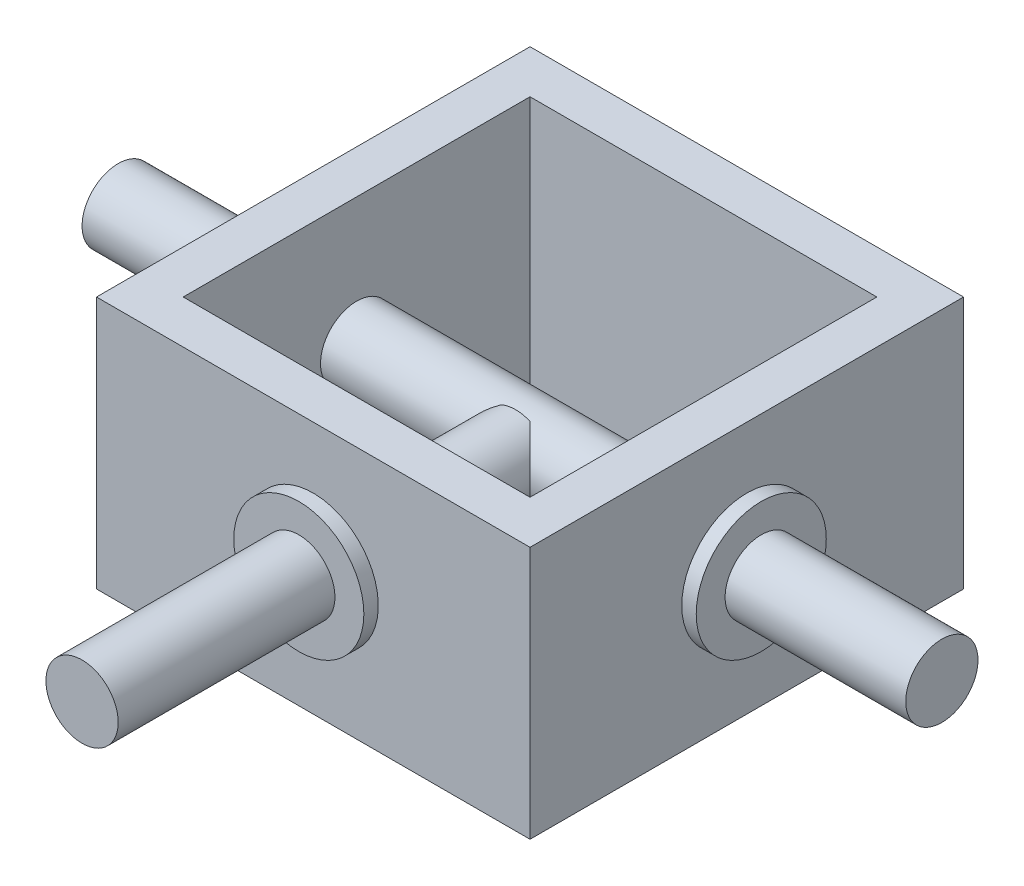
ISO-10303-21;
HEADER;
FILE_DESCRIPTION(('STEP AP214'),'2;1');
FILE_NAME('part.step','',(''),(''),'','','');
FILE_SCHEMA(('AUTOMOTIVE_DESIGN { 1 0 10303 214 1 1 1 1 }'));
ENDSEC;
DATA;
#1=APPLICATION_CONTEXT('core data for automotive mechanical design processes');
#2=APPLICATION_PROTOCOL_DEFINITION('international standard','automotive_design',2000,#1);
#3=PRODUCT_CONTEXT('',#1,'mechanical');
#4=PRODUCT('Part','Part','',(#3));
#5=PRODUCT_RELATED_PRODUCT_CATEGORY('part','',(#4));
#6=PRODUCT_DEFINITION_FORMATION('','',#4);
#7=PRODUCT_DEFINITION_CONTEXT('part definition',#1,'design');
#8=PRODUCT_DEFINITION('design','',#6,#7);
#9=PRODUCT_DEFINITION_SHAPE('','',#8);
#10=(LENGTH_UNIT() NAMED_UNIT(*) SI_UNIT(.MILLI.,.METRE.));
#11=(NAMED_UNIT(*) PLANE_ANGLE_UNIT() SI_UNIT($,.RADIAN.));
#12=(NAMED_UNIT(*) SI_UNIT($,.STERADIAN.) SOLID_ANGLE_UNIT());
#13=UNCERTAINTY_MEASURE_WITH_UNIT(LENGTH_MEASURE(1.E-05),#10,'distance_accuracy_value','');
#14=(GEOMETRIC_REPRESENTATION_CONTEXT(3) GLOBAL_UNCERTAINTY_ASSIGNED_CONTEXT((#13)) GLOBAL_UNIT_ASSIGNED_CONTEXT((#10,
#11,#12)) REPRESENTATION_CONTEXT('',''));
#15=CARTESIAN_POINT('',(0.,0.,0.));
#16=DIRECTION('',(0.,0.,1.));
#17=DIRECTION('',(1.,0.,0.));
#18=AXIS2_PLACEMENT_3D('',#15,#16,#17);
#19=CARTESIAN_POINT('',(-57.,17.5,0.));
#20=DIRECTION('',(1.,0.,0.));
#21=DIRECTION('',(0.,0.,-1.));
#22=AXIS2_PLACEMENT_3D('',#19,#20,#21);
#23=CYLINDRICAL_SURFACE('',#22,5.);
#24=CARTESIAN_POINT('',(24.,17.5,0.));
#25=DIRECTION('',(-1.,0.,0.));
#26=DIRECTION('',(0.,0.,1.));
#27=AXIS2_PLACEMENT_3D('',#24,#25,#26);
#28=CIRCLE('',#27,5.);
#29=CARTESIAN_POINT('',(24.,17.5,5.));
#30=VERTEX_POINT('',#29);
#31=EDGE_CURVE('E154',#30,#30,#28,.T.);
#32=ORIENTED_EDGE('',*,*,#31,.T.);
#33=EDGE_LOOP('',(#32));
#34=FACE_BOUND('',#33,.T.);
#35=CARTESIAN_POINT('',(-24.,17.5,0.));
#36=DIRECTION('',(1.,0.,0.));
#37=DIRECTION('',(0.,0.,-1.));
#38=AXIS2_PLACEMENT_3D('',#35,#36,#37);
#39=CIRCLE('',#38,5.);
#40=CARTESIAN_POINT('',(-24.,17.5,-5.));
#41=VERTEX_POINT('',#40);
#42=EDGE_CURVE('E150',#41,#41,#39,.T.);
#43=ORIENTED_EDGE('',*,*,#42,.T.);
#44=EDGE_LOOP('',(#43));
#45=FACE_BOUND('',#44,.T.);
#46=CARTESIAN_POINT('',(0.,17.5,0.));
#47=DIRECTION('',(0.707106781186547,0.,-0.707106781186548));
#48=DIRECTION('',(0.707106781186547,0.,0.707106781186548));
#49=AXIS2_PLACEMENT_3D('',#46,#47,#48);
#50=ELLIPSE('',#49,7.07106781186548,5.);
#51=CARTESIAN_POINT('',(2.00000000000001,12.9174243050442,2.));
#52=VERTEX_POINT('',#51);
#53=CARTESIAN_POINT('',(2.00000000000001,22.0825756949558,2.));
#54=VERTEX_POINT('',#53);
#55=EDGE_CURVE('E127',#52,#54,#50,.F.);
#56=ORIENTED_EDGE('',*,*,#55,.F.);
#57=DIRECTION('',(1.,0.,0.));
#58=VECTOR('',#57,1.);
#59=CARTESIAN_POINT('',(-57.,12.9174243050442,2.));
#60=LINE('',#59,#58);
#61=CARTESIAN_POINT('',(-2.00000000000001,12.9174243050442,2.));
#62=VERTEX_POINT('',#61);
#63=EDGE_CURVE('E11',#52,#62,#60,.F.);
#64=ORIENTED_EDGE('',*,*,#63,.T.);
#65=CARTESIAN_POINT('',(0.,17.5,0.));
#66=DIRECTION('',(0.707106781186547,0.,0.707106781186548));
#67=DIRECTION('',(0.707106781186547,0.,-0.707106781186548));
#68=AXIS2_PLACEMENT_3D('',#65,#66,#67);
#69=ELLIPSE('',#68,7.07106781186548,5.);
#70=CARTESIAN_POINT('',(-2.00000000000001,22.0825756949558,2.));
#71=VERTEX_POINT('',#70);
#72=EDGE_CURVE('E54',#71,#62,#69,.T.);
#73=ORIENTED_EDGE('',*,*,#72,.F.);
#74=DIRECTION('',(1.,0.,0.));
#75=VECTOR('',#74,1.);
#76=CARTESIAN_POINT('',(-57.,22.0825756949558,2.));
#77=LINE('',#76,#75);
#78=EDGE_CURVE('E121',#71,#54,#77,.T.);
#79=ORIENTED_EDGE('',*,*,#78,.T.);
#80=EDGE_LOOP('',(#56,#64,#73,#79));
#81=FACE_BOUND('',#80,.T.);
#82=ADVANCED_FACE('F45',(#34,#45,#81),#23,.T.);
#83=CARTESIAN_POINT('',(30.,35.,30.));
#84=DIRECTION('',(-1.,0.,0.));
#85=DIRECTION('',(0.,0.,1.));
#86=AXIS2_PLACEMENT_3D('',#83,#84,#85);
#87=PLANE('',#86);
#88=DIRECTION('',(0.,0.,-1.));
#89=VECTOR('',#88,1.);
#90=CARTESIAN_POINT('',(30.,0.,30.));
#91=LINE('',#90,#89);
#92=CARTESIAN_POINT('',(30.,0.,30.));
#93=VERTEX_POINT('',#92);
#94=CARTESIAN_POINT('',(30.,0.,-30.));
#95=VERTEX_POINT('',#94);
#96=EDGE_CURVE('E182',#93,#95,#91,.T.);
#97=ORIENTED_EDGE('',*,*,#96,.T.);
#98=DIRECTION('',(0.,-1.,0.));
#99=VECTOR('',#98,1.);
#100=CARTESIAN_POINT('',(30.,35.,-30.));
#101=LINE('',#100,#99);
#102=CARTESIAN_POINT('',(30.,35.,-30.));
#103=VERTEX_POINT('',#102);
#104=EDGE_CURVE('E149',#103,#95,#101,.T.);
#105=ORIENTED_EDGE('',*,*,#104,.F.);
#106=DIRECTION('',(0.,0.,-1.));
#107=VECTOR('',#106,1.);
#108=CARTESIAN_POINT('',(30.,35.,30.));
#109=LINE('',#108,#107);
#110=CARTESIAN_POINT('',(30.,35.,30.));
#111=VERTEX_POINT('',#110);
#112=EDGE_CURVE('E175',#111,#103,#109,.T.);
#113=ORIENTED_EDGE('',*,*,#112,.F.);
#114=DIRECTION('',(0.,-1.,0.));
#115=VECTOR('',#114,1.);
#116=CARTESIAN_POINT('',(30.,35.,30.));
#117=LINE('',#116,#115);
#118=EDGE_CURVE('E167',#111,#93,#117,.T.);
#119=ORIENTED_EDGE('',*,*,#118,.T.);
#120=EDGE_LOOP('',(#97,#105,#113,#119));
#121=FACE_BOUND('',#120,.T.);
#122=CARTESIAN_POINT('',(30.,17.5,0.));
#123=DIRECTION('',(-1.,0.,0.));
#124=DIRECTION('',(0.,0.,1.));
#125=AXIS2_PLACEMENT_3D('',#122,#123,#124);
#126=CIRCLE('',#125,9.);
#127=CARTESIAN_POINT('',(30.,17.5,9.));
#128=VERTEX_POINT('',#127);
#129=EDGE_CURVE('E128',#128,#128,#126,.F.);
#130=ORIENTED_EDGE('',*,*,#129,.F.);
#131=EDGE_LOOP('',(#130));
#132=FACE_BOUND('',#131,.T.);
#133=ADVANCED_FACE('F47',(#121,#132),#87,.F.);
#134=CARTESIAN_POINT('',(-30.,35.,30.));
#135=DIRECTION('',(0.,0.,-1.));
#136=DIRECTION('',(-1.,0.,0.));
#137=AXIS2_PLACEMENT_3D('',#134,#135,#136);
#138=PLANE('',#137);
#139=DIRECTION('',(1.,0.,0.));
#140=VECTOR('',#139,1.);
#141=CARTESIAN_POINT('',(-30.,0.,30.));
#142=LINE('',#141,#140);
#143=CARTESIAN_POINT('',(-30.,0.,30.));
#144=VERTEX_POINT('',#143);
#145=EDGE_CURVE('E172',#144,#93,#142,.T.);
#146=ORIENTED_EDGE('',*,*,#145,.T.);
#147=ORIENTED_EDGE('',*,*,#118,.F.);
#148=DIRECTION('',(1.,0.,0.));
#149=VECTOR('',#148,1.);
#150=CARTESIAN_POINT('',(-30.,35.,30.));
#151=LINE('',#150,#149);
#152=CARTESIAN_POINT('',(-30.,35.,30.));
#153=VERTEX_POINT('',#152);
#154=EDGE_CURVE('E171',#153,#111,#151,.T.);
#155=ORIENTED_EDGE('',*,*,#154,.F.);
#156=DIRECTION('',(0.,-1.,0.));
#157=VECTOR('',#156,1.);
#158=CARTESIAN_POINT('',(-30.,35.,30.));
#159=LINE('',#158,#157);
#160=EDGE_CURVE('E163',#153,#144,#159,.T.);
#161=ORIENTED_EDGE('',*,*,#160,.T.);
#162=EDGE_LOOP('',(#146,#147,#155,#161));
#163=FACE_BOUND('',#162,.T.);
#164=CARTESIAN_POINT('',(0.,17.5,30.));
#165=DIRECTION('',(0.,0.,-1.));
#166=DIRECTION('',(-1.,0.,0.));
#167=AXIS2_PLACEMENT_3D('',#164,#165,#166);
#168=CIRCLE('',#167,9.);
#169=CARTESIAN_POINT('',(-9.,17.5,30.));
#170=VERTEX_POINT('',#169);
#171=EDGE_CURVE('E145',#170,#170,#168,.F.);
#172=ORIENTED_EDGE('',*,*,#171,.F.);
#173=EDGE_LOOP('',(#172));
#174=FACE_BOUND('',#173,.T.);
#175=ADVANCED_FACE('F305',(#163,#174),#138,.F.);
#176=CARTESIAN_POINT('',(0.,35.,0.));
#177=DIRECTION('',(0.,-1.,0.));
#178=DIRECTION('',(0.,0.,-1.));
#179=AXIS2_PLACEMENT_3D('',#176,#177,#178);
#180=PLANE('',#179);
#181=ORIENTED_EDGE('',*,*,#112,.T.);
#182=DIRECTION('',(-1.,0.,0.));
#183=VECTOR('',#182,1.);
#184=CARTESIAN_POINT('',(-30.,35.,-30.));
#185=LINE('',#184,#183);
#186=CARTESIAN_POINT('',(-30.,35.,-30.));
#187=VERTEX_POINT('',#186);
#188=EDGE_CURVE('E192',#103,#187,#185,.T.);
#189=ORIENTED_EDGE('',*,*,#188,.T.);
#190=DIRECTION('',(0.,0.,1.));
#191=VECTOR('',#190,1.);
#192=CARTESIAN_POINT('',(-30.,35.,30.));
#193=LINE('',#192,#191);
#194=EDGE_CURVE('E189',#187,#153,#193,.T.);
#195=ORIENTED_EDGE('',*,*,#194,.T.);
#196=ORIENTED_EDGE('',*,*,#154,.T.);
#197=EDGE_LOOP('',(#181,#189,#195,#196));
#198=FACE_BOUND('',#197,.T.);
#199=DIRECTION('',(0.,0.,-1.));
#200=VECTOR('',#199,1.);
#201=CARTESIAN_POINT('',(24.,35.,24.));
#202=LINE('',#201,#200);
#203=CARTESIAN_POINT('',(24.,35.,24.));
#204=VERTEX_POINT('',#203);
#205=CARTESIAN_POINT('',(24.,35.,-24.));
#206=VERTEX_POINT('',#205);
#207=EDGE_CURVE('E215',#204,#206,#202,.T.);
#208=ORIENTED_EDGE('',*,*,#207,.F.);
#209=DIRECTION('',(1.,0.,0.));
#210=VECTOR('',#209,1.);
#211=CARTESIAN_POINT('',(-24.,35.,24.));
#212=LINE('',#211,#210);
#213=CARTESIAN_POINT('',(-24.,35.,24.));
#214=VERTEX_POINT('',#213);
#215=EDGE_CURVE('E210',#214,#204,#212,.T.);
#216=ORIENTED_EDGE('',*,*,#215,.F.);
#217=DIRECTION('',(0.,0.,1.));
#218=VECTOR('',#217,1.);
#219=CARTESIAN_POINT('',(-24.,35.,24.));
#220=LINE('',#219,#218);
#221=CARTESIAN_POINT('',(-24.,35.,-24.));
#222=VERTEX_POINT('',#221);
#223=EDGE_CURVE('E230',#222,#214,#220,.T.);
#224=ORIENTED_EDGE('',*,*,#223,.F.);
#225=DIRECTION('',(-1.,0.,0.));
#226=VECTOR('',#225,1.);
#227=CARTESIAN_POINT('',(-24.,35.,-24.));
#228=LINE('',#227,#226);
#229=EDGE_CURVE('E233',#206,#222,#228,.T.);
#230=ORIENTED_EDGE('',*,*,#229,.F.);
#231=EDGE_LOOP('',(#208,#216,#224,#230));
#232=FACE_BOUND('',#231,.T.);
#233=ADVANCED_FACE('F359',(#198,#232),#180,.F.);
#234=CARTESIAN_POINT('',(0.,0.,0.));
#235=DIRECTION('',(0.,-1.,0.));
#236=DIRECTION('',(0.,0.,-1.));
#237=AXIS2_PLACEMENT_3D('',#234,#235,#236);
#238=PLANE('',#237);
#239=ORIENTED_EDGE('',*,*,#96,.F.);
#240=ORIENTED_EDGE('',*,*,#145,.F.);
#241=DIRECTION('',(0.,0.,1.));
#242=VECTOR('',#241,1.);
#243=CARTESIAN_POINT('',(-30.,0.,30.));
#244=LINE('',#243,#242);
#245=CARTESIAN_POINT('',(-30.,0.,-30.));
#246=VERTEX_POINT('',#245);
#247=EDGE_CURVE('E176',#246,#144,#244,.T.);
#248=ORIENTED_EDGE('',*,*,#247,.F.);
#249=DIRECTION('',(-1.,0.,0.));
#250=VECTOR('',#249,1.);
#251=CARTESIAN_POINT('',(-30.,0.,-30.));
#252=LINE('',#251,#250);
#253=EDGE_CURVE('E179',#95,#246,#252,.T.);
#254=ORIENTED_EDGE('',*,*,#253,.F.);
#255=EDGE_LOOP('',(#239,#240,#248,#254));
#256=FACE_BOUND('',#255,.T.);
#257=DIRECTION('',(1.,0.,0.));
#258=VECTOR('',#257,1.);
#259=CARTESIAN_POINT('',(-24.,0.,24.));
#260=LINE('',#259,#258);
#261=CARTESIAN_POINT('',(-24.,0.,24.));
#262=VERTEX_POINT('',#261);
#263=CARTESIAN_POINT('',(24.,0.,24.));
#264=VERTEX_POINT('',#263);
#265=EDGE_CURVE('E211',#262,#264,#260,.T.);
#266=ORIENTED_EDGE('',*,*,#265,.T.);
#267=DIRECTION('',(0.,0.,-1.));
#268=VECTOR('',#267,1.);
#269=CARTESIAN_POINT('',(24.,0.,24.));
#270=LINE('',#269,#268);
#271=CARTESIAN_POINT('',(24.,0.,-24.));
#272=VERTEX_POINT('',#271);
#273=EDGE_CURVE('E224',#264,#272,#270,.T.);
#274=ORIENTED_EDGE('',*,*,#273,.T.);
#275=DIRECTION('',(-1.,0.,0.));
#276=VECTOR('',#275,1.);
#277=CARTESIAN_POINT('',(-24.,0.,-24.));
#278=LINE('',#277,#276);
#279=CARTESIAN_POINT('',(-24.,0.,-24.));
#280=VERTEX_POINT('',#279);
#281=EDGE_CURVE('E220',#272,#280,#278,.T.);
#282=ORIENTED_EDGE('',*,*,#281,.T.);
#283=DIRECTION('',(0.,0.,1.));
#284=VECTOR('',#283,1.);
#285=CARTESIAN_POINT('',(-24.,0.,24.));
#286=LINE('',#285,#284);
#287=EDGE_CURVE('E216',#280,#262,#286,.T.);
#288=ORIENTED_EDGE('',*,*,#287,.T.);
#289=EDGE_LOOP('',(#266,#274,#282,#288));
#290=FACE_BOUND('',#289,.T.);
#291=ADVANCED_FACE('F353',(#256,#290),#238,.T.);
#292=CARTESIAN_POINT('',(-30.,35.,-30.));
#293=DIRECTION('',(0.,0.,1.));
#294=DIRECTION('',(1.,0.,0.));
#295=AXIS2_PLACEMENT_3D('',#292,#293,#294);
#296=PLANE('',#295);
#297=ORIENTED_EDGE('',*,*,#253,.T.);
#298=DIRECTION('',(0.,-1.,0.));
#299=VECTOR('',#298,1.);
#300=CARTESIAN_POINT('',(-30.,35.,-30.));
#301=LINE('',#300,#299);
#302=EDGE_CURVE('E159',#187,#246,#301,.T.);
#303=ORIENTED_EDGE('',*,*,#302,.F.);
#304=ORIENTED_EDGE('',*,*,#188,.F.);
#305=ORIENTED_EDGE('',*,*,#104,.T.);
#306=EDGE_LOOP('',(#297,#303,#304,#305));
#307=FACE_BOUND('',#306,.T.);
#308=ADVANCED_FACE('F340',(#307),#296,.F.);
#309=CARTESIAN_POINT('',(-30.,35.,30.));
#310=DIRECTION('',(1.,0.,0.));
#311=DIRECTION('',(0.,0.,-1.));
#312=AXIS2_PLACEMENT_3D('',#309,#310,#311);
#313=PLANE('',#312);
#314=CARTESIAN_POINT('',(-30.,17.5,0.));
#315=DIRECTION('',(1.,0.,0.));
#316=DIRECTION('',(0.,0.,-1.));
#317=AXIS2_PLACEMENT_3D('',#314,#315,#316);
#318=CIRCLE('',#317,9.);
#319=CARTESIAN_POINT('',(-30.,17.5,-9.));
#320=VERTEX_POINT('',#319);
#321=EDGE_CURVE('E257',#320,#320,#318,.T.);
#322=ORIENTED_EDGE('',*,*,#321,.T.);
#323=EDGE_LOOP('',(#322));
#324=FACE_BOUND('',#323,.T.);
#325=ORIENTED_EDGE('',*,*,#247,.T.);
#326=ORIENTED_EDGE('',*,*,#160,.F.);
#327=ORIENTED_EDGE('',*,*,#194,.F.);
#328=ORIENTED_EDGE('',*,*,#302,.T.);
#329=EDGE_LOOP('',(#325,#326,#327,#328));
#330=FACE_BOUND('',#329,.T.);
#331=ADVANCED_FACE('F336',(#324,#330),#313,.F.);
#332=CARTESIAN_POINT('',(24.,35.,24.));
#333=DIRECTION('',(-1.,0.,0.));
#334=DIRECTION('',(0.,0.,1.));
#335=AXIS2_PLACEMENT_3D('',#332,#333,#334);
#336=PLANE('',#335);
#337=ORIENTED_EDGE('',*,*,#31,.F.);
#338=EDGE_LOOP('',(#337));
#339=FACE_BOUND('',#338,.T.);
#340=ORIENTED_EDGE('',*,*,#273,.F.);
#341=DIRECTION('',(0.,-1.,0.));
#342=VECTOR('',#341,1.);
#343=CARTESIAN_POINT('',(24.,35.,24.));
#344=LINE('',#343,#342);
#345=EDGE_CURVE('E206',#204,#264,#344,.T.);
#346=ORIENTED_EDGE('',*,*,#345,.F.);
#347=ORIENTED_EDGE('',*,*,#207,.T.);
#348=DIRECTION('',(0.,-1.,0.));
#349=VECTOR('',#348,1.);
#350=CARTESIAN_POINT('',(24.,35.,-24.));
#351=LINE('',#350,#349);
#352=EDGE_CURVE('E186',#206,#272,#351,.T.);
#353=ORIENTED_EDGE('',*,*,#352,.T.);
#354=EDGE_LOOP('',(#340,#346,#347,#353));
#355=FACE_BOUND('',#354,.T.);
#356=ADVANCED_FACE('F339',(#339,#355),#336,.T.);
#357=CARTESIAN_POINT('',(-24.,35.,-24.));
#358=DIRECTION('',(0.,0.,1.));
#359=DIRECTION('',(1.,0.,0.));
#360=AXIS2_PLACEMENT_3D('',#357,#358,#359);
#361=PLANE('',#360);
#362=ORIENTED_EDGE('',*,*,#281,.F.);
#363=ORIENTED_EDGE('',*,*,#352,.F.);
#364=ORIENTED_EDGE('',*,*,#229,.T.);
#365=DIRECTION('',(0.,-1.,0.));
#366=VECTOR('',#365,1.);
#367=CARTESIAN_POINT('',(-24.,35.,-24.));
#368=LINE('',#367,#366);
#369=EDGE_CURVE('E201',#222,#280,#368,.T.);
#370=ORIENTED_EDGE('',*,*,#369,.T.);
#371=EDGE_LOOP('',(#362,#363,#364,#370));
#372=FACE_BOUND('',#371,.T.);
#373=ADVANCED_FACE('F375',(#372),#361,.T.);
#374=CARTESIAN_POINT('',(-24.,35.,24.));
#375=DIRECTION('',(1.,0.,0.));
#376=DIRECTION('',(0.,0.,-1.));
#377=AXIS2_PLACEMENT_3D('',#374,#375,#376);
#378=PLANE('',#377);
#379=ORIENTED_EDGE('',*,*,#42,.F.);
#380=EDGE_LOOP('',(#379));
#381=FACE_BOUND('',#380,.T.);
#382=ORIENTED_EDGE('',*,*,#287,.F.);
#383=ORIENTED_EDGE('',*,*,#369,.F.);
#384=ORIENTED_EDGE('',*,*,#223,.T.);
#385=DIRECTION('',(0.,-1.,0.));
#386=VECTOR('',#385,1.);
#387=CARTESIAN_POINT('',(-24.,35.,24.));
#388=LINE('',#387,#386);
#389=EDGE_CURVE('E68',#214,#262,#388,.T.);
#390=ORIENTED_EDGE('',*,*,#389,.T.);
#391=EDGE_LOOP('',(#382,#383,#384,#390));
#392=FACE_BOUND('',#391,.T.);
#393=ADVANCED_FACE('F378',(#381,#392),#378,.T.);
#394=CARTESIAN_POINT('',(-24.,35.,24.));
#395=DIRECTION('',(0.,0.,-1.));
#396=DIRECTION('',(-1.,0.,0.));
#397=AXIS2_PLACEMENT_3D('',#394,#395,#396);
#398=PLANE('',#397);
#399=CARTESIAN_POINT('',(0.,17.5,24.));
#400=DIRECTION('',(0.,0.,-1.));
#401=DIRECTION('',(-1.,0.,0.));
#402=AXIS2_PLACEMENT_3D('',#399,#400,#401);
#403=CIRCLE('',#402,5.);
#404=CARTESIAN_POINT('',(-5.,17.5,24.));
#405=VERTEX_POINT('',#404);
#406=EDGE_CURVE('E135',#405,#405,#403,.T.);
#407=ORIENTED_EDGE('',*,*,#406,.F.);
#408=EDGE_LOOP('',(#407));
#409=FACE_BOUND('',#408,.T.);
#410=ORIENTED_EDGE('',*,*,#265,.F.);
#411=ORIENTED_EDGE('',*,*,#389,.F.);
#412=ORIENTED_EDGE('',*,*,#215,.T.);
#413=ORIENTED_EDGE('',*,*,#345,.T.);
#414=EDGE_LOOP('',(#410,#411,#412,#413));
#415=FACE_BOUND('',#414,.T.);
#416=ADVANCED_FACE('F382',(#409,#415),#398,.T.);
#417=CARTESIAN_POINT('',(0.,17.5,32.));
#418=DIRECTION('',(0.,0.,1.));
#419=DIRECTION('',(1.,0.,0.));
#420=AXIS2_PLACEMENT_3D('',#417,#418,#419);
#421=PLANE('',#420);
#422=CARTESIAN_POINT('',(0.,17.5,32.));
#423=DIRECTION('',(0.,0.,1.));
#424=DIRECTION('',(1.,0.,0.));
#425=AXIS2_PLACEMENT_3D('',#422,#423,#424);
#426=CIRCLE('',#425,9.);
#427=CARTESIAN_POINT('',(9.,17.5,32.));
#428=VERTEX_POINT('',#427);
#429=EDGE_CURVE('E155',#428,#428,#426,.T.);
#430=ORIENTED_EDGE('',*,*,#429,.T.);
#431=EDGE_LOOP('',(#430));
#432=FACE_BOUND('',#431,.T.);
#433=CARTESIAN_POINT('',(0.,17.5,32.));
#434=DIRECTION('',(0.,0.,1.));
#435=DIRECTION('',(1.,0.,0.));
#436=AXIS2_PLACEMENT_3D('',#433,#434,#435);
#437=CIRCLE('',#436,5.);
#438=CARTESIAN_POINT('',(5.,17.5,32.));
#439=VERTEX_POINT('',#438);
#440=EDGE_CURVE('E244',#439,#439,#437,.T.);
#441=ORIENTED_EDGE('',*,*,#440,.F.);
#442=EDGE_LOOP('',(#441));
#443=FACE_BOUND('',#442,.T.);
#444=ADVANCED_FACE('F386',(#432,#443),#421,.T.);
#445=CARTESIAN_POINT('',(0.,17.5,32.));
#446=DIRECTION('',(0.,0.,-1.));
#447=DIRECTION('',(-1.,0.,0.));
#448=AXIS2_PLACEMENT_3D('',#445,#446,#447);
#449=CYLINDRICAL_SURFACE('',#448,9.);
#450=ORIENTED_EDGE('',*,*,#429,.F.);
#451=EDGE_LOOP('',(#450));
#452=FACE_BOUND('',#451,.T.);
#453=ORIENTED_EDGE('',*,*,#171,.T.);
#454=EDGE_LOOP('',(#453));
#455=FACE_BOUND('',#454,.T.);
#456=ADVANCED_FACE('F388',(#452,#455),#449,.T.);
#457=CARTESIAN_POINT('',(32.,17.5,0.));
#458=DIRECTION('',(1.,0.,0.));
#459=DIRECTION('',(0.,0.,-1.));
#460=AXIS2_PLACEMENT_3D('',#457,#458,#459);
#461=PLANE('',#460);
#462=CARTESIAN_POINT('',(32.,17.5,0.));
#463=DIRECTION('',(1.,0.,0.));
#464=DIRECTION('',(0.,0.,-1.));
#465=AXIS2_PLACEMENT_3D('',#462,#463,#464);
#466=CIRCLE('',#465,9.);
#467=CARTESIAN_POINT('',(32.,17.5,-9.));
#468=VERTEX_POINT('',#467);
#469=EDGE_CURVE('E248',#468,#468,#466,.T.);
#470=ORIENTED_EDGE('',*,*,#469,.T.);
#471=EDGE_LOOP('',(#470));
#472=FACE_BOUND('',#471,.T.);
#473=CARTESIAN_POINT('',(32.,17.5,0.));
#474=DIRECTION('',(1.,0.,0.));
#475=DIRECTION('',(0.,0.,-1.));
#476=AXIS2_PLACEMENT_3D('',#473,#474,#475);
#477=CIRCLE('',#476,5.);
#478=CARTESIAN_POINT('',(32.,17.5,-5.));
#479=VERTEX_POINT('',#478);
#480=EDGE_CURVE('E252',#479,#479,#477,.T.);
#481=ORIENTED_EDGE('',*,*,#480,.F.);
#482=EDGE_LOOP('',(#481));
#483=FACE_BOUND('',#482,.T.);
#484=ADVANCED_FACE('F391',(#472,#483),#461,.T.);
#485=CARTESIAN_POINT('',(32.,17.5,0.));
#486=DIRECTION('',(-1.,0.,0.));
#487=DIRECTION('',(0.,0.,1.));
#488=AXIS2_PLACEMENT_3D('',#485,#486,#487);
#489=CYLINDRICAL_SURFACE('',#488,9.);
#490=ORIENTED_EDGE('',*,*,#469,.F.);
#491=EDGE_LOOP('',(#490));
#492=FACE_BOUND('',#491,.T.);
#493=ORIENTED_EDGE('',*,*,#129,.T.);
#494=EDGE_LOOP('',(#493));
#495=FACE_BOUND('',#494,.T.);
#496=ADVANCED_FACE('F332',(#492,#495),#489,.T.);
#497=CARTESIAN_POINT('',(-32.,17.5,0.));
#498=DIRECTION('',(1.,0.,0.));
#499=DIRECTION('',(0.,0.,-1.));
#500=AXIS2_PLACEMENT_3D('',#497,#498,#499);
#501=CYLINDRICAL_SURFACE('',#500,9.);
#502=CARTESIAN_POINT('',(-32.,17.5,0.));
#503=DIRECTION('',(1.,0.,0.));
#504=DIRECTION('',(0.,0.,-1.));
#505=AXIS2_PLACEMENT_3D('',#502,#503,#504);
#506=CIRCLE('',#505,9.);
#507=CARTESIAN_POINT('',(-32.,17.5,-9.));
#508=VERTEX_POINT('',#507);
#509=EDGE_CURVE('E256',#508,#508,#506,.T.);
#510=ORIENTED_EDGE('',*,*,#509,.T.);
#511=EDGE_LOOP('',(#510));
#512=FACE_BOUND('',#511,.T.);
#513=ORIENTED_EDGE('',*,*,#321,.F.);
#514=EDGE_LOOP('',(#513));
#515=FACE_BOUND('',#514,.T.);
#516=ADVANCED_FACE('F327',(#512,#515),#501,.T.);
#517=CARTESIAN_POINT('',(-32.,17.5,0.));
#518=DIRECTION('',(-1.,0.,0.));
#519=DIRECTION('',(0.,0.,-1.));
#520=AXIS2_PLACEMENT_3D('',#517,#518,#519);
#521=PLANE('',#520);
#522=CARTESIAN_POINT('',(-32.,17.5,0.));
#523=DIRECTION('',(-1.,0.,0.));
#524=DIRECTION('',(0.,0.,1.));
#525=AXIS2_PLACEMENT_3D('',#522,#523,#524);
#526=CIRCLE('',#525,5.);
#527=CARTESIAN_POINT('',(-32.,17.5,-5.));
#528=VERTEX_POINT('',#527);
#529=EDGE_CURVE('E261',#528,#528,#526,.T.);
#530=ORIENTED_EDGE('',*,*,#529,.F.);
#531=EDGE_LOOP('',(#530));
#532=FACE_BOUND('',#531,.T.);
#533=ORIENTED_EDGE('',*,*,#509,.F.);
#534=EDGE_LOOP('',(#533));
#535=FACE_BOUND('',#534,.T.);
#536=ADVANCED_FACE('F319',(#532,#535),#521,.T.);
#537=CARTESIAN_POINT('',(-57.,17.5,0.));
#538=DIRECTION('',(1.,0.,0.));
#539=DIRECTION('',(0.,0.,-1.));
#540=AXIS2_PLACEMENT_3D('',#537,#538,#539);
#541=PLANE('',#540);
#542=CARTESIAN_POINT('',(-57.,17.5,0.));
#543=DIRECTION('',(1.,0.,0.));
#544=DIRECTION('',(0.,0.,-1.));
#545=AXIS2_PLACEMENT_3D('',#542,#543,#544);
#546=CIRCLE('',#545,5.);
#547=CARTESIAN_POINT('',(-57.,17.5,-5.));
#548=VERTEX_POINT('',#547);
#549=EDGE_CURVE('E268',#548,#548,#546,.T.);
#550=ORIENTED_EDGE('',*,*,#549,.F.);
#551=EDGE_LOOP('',(#550));
#552=FACE_BOUND('',#551,.T.);
#553=ADVANCED_FACE('F311',(#552),#541,.F.);
#554=CARTESIAN_POINT('',(-32.,17.5,-5.));
#555=CARTESIAN_POINT('',(-32.2604166666667,17.5,-5.));
#556=CARTESIAN_POINT('',(-32.5208333333333,17.5,-5.));
#557=CARTESIAN_POINT('',(-33.0416666666667,17.5,-5.));
#558=CARTESIAN_POINT('',(-33.3020833333333,17.5,-5.));
#559=CARTESIAN_POINT('',(-33.8229166666667,17.5,-5.));
#560=CARTESIAN_POINT('',(-34.0833333333333,17.5,-5.));
#561=CARTESIAN_POINT('',(-34.6041666666667,17.5,-5.));
#562=CARTESIAN_POINT('',(-34.8645833333333,17.5,-5.));
#563=CARTESIAN_POINT('',(-35.3854166666667,17.5,-5.));
#564=CARTESIAN_POINT('',(-35.6458333333333,17.5,-5.));
#565=CARTESIAN_POINT('',(-36.1666666666667,17.5,-5.));
#566=CARTESIAN_POINT('',(-36.4270833333333,17.5,-5.));
#567=CARTESIAN_POINT('',(-36.9479166666667,17.5,-5.));
#568=CARTESIAN_POINT('',(-37.2083333333333,17.5,-5.));
#569=CARTESIAN_POINT('',(-37.7291666666667,17.5,-5.));
#570=CARTESIAN_POINT('',(-37.9895833333333,17.5,-5.));
#571=CARTESIAN_POINT('',(-38.5104166666667,17.5,-5.));
#572=CARTESIAN_POINT('',(-38.7708333333333,17.5,-5.));
#573=CARTESIAN_POINT('',(-39.2916666666667,17.5,-5.));
#574=CARTESIAN_POINT('',(-39.5520833333333,17.5,-5.));
#575=CARTESIAN_POINT('',(-40.0729166666667,17.5,-5.));
#576=CARTESIAN_POINT('',(-40.3333333333333,17.5,-5.));
#577=CARTESIAN_POINT('',(-40.8541666666667,17.5,-5.));
#578=CARTESIAN_POINT('',(-41.1145833333333,17.5,-5.));
#579=CARTESIAN_POINT('',(-41.6354166666667,17.5,-5.));
#580=CARTESIAN_POINT('',(-41.8958333333333,17.5,-5.));
#581=CARTESIAN_POINT('',(-42.4166666666667,17.5,-5.));
#582=CARTESIAN_POINT('',(-42.6770833333333,17.5,-5.));
#583=CARTESIAN_POINT('',(-43.1979166666667,17.5,-5.));
#584=CARTESIAN_POINT('',(-43.4583333333333,17.5,-5.));
#585=CARTESIAN_POINT('',(-43.9791666666667,17.5,-5.));
#586=CARTESIAN_POINT('',(-44.2395833333333,17.5,-5.));
#587=CARTESIAN_POINT('',(-44.7604166666667,17.5,-5.));
#588=CARTESIAN_POINT('',(-45.0208333333333,17.5,-5.));
#589=CARTESIAN_POINT('',(-45.5416666666667,17.5,-5.));
#590=CARTESIAN_POINT('',(-45.8020833333333,17.5,-5.));
#591=CARTESIAN_POINT('',(-46.3229166666667,17.5,-5.));
#592=CARTESIAN_POINT('',(-46.5833333333333,17.5,-5.));
#593=CARTESIAN_POINT('',(-47.1041666666667,17.5,-5.));
#594=CARTESIAN_POINT('',(-47.3645833333333,17.5,-5.));
#595=CARTESIAN_POINT('',(-47.8854166666667,17.5,-5.));
#596=CARTESIAN_POINT('',(-48.1458333333333,17.5,-5.));
#597=CARTESIAN_POINT('',(-48.6666666666667,17.5,-5.));
#598=CARTESIAN_POINT('',(-48.9270833333333,17.5,-5.));
#599=CARTESIAN_POINT('',(-49.4479166666667,17.5,-5.));
#600=CARTESIAN_POINT('',(-49.7083333333333,17.5,-5.));
#601=CARTESIAN_POINT('',(-50.2291666666667,17.5,-5.));
#602=CARTESIAN_POINT('',(-50.4895833333333,17.5,-5.));
#603=CARTESIAN_POINT('',(-51.0104166666667,17.5,-5.));
#604=CARTESIAN_POINT('',(-51.2708333333333,17.5,-5.));
#605=CARTESIAN_POINT('',(-51.7916666666667,17.5,-5.));
#606=CARTESIAN_POINT('',(-52.0520833333333,17.5,-5.));
#607=CARTESIAN_POINT('',(-52.5729166666667,17.5,-5.));
#608=CARTESIAN_POINT('',(-52.8333333333333,17.5,-5.));
#609=CARTESIAN_POINT('',(-53.3541666666667,17.5,-5.));
#610=CARTESIAN_POINT('',(-53.6145833333333,17.5,-5.));
#611=CARTESIAN_POINT('',(-54.1354166666667,17.5,-5.));
#612=CARTESIAN_POINT('',(-54.3958333333333,17.5,-5.));
#613=CARTESIAN_POINT('',(-54.9166666666667,17.5,-5.));
#614=CARTESIAN_POINT('',(-55.1770833333333,17.5,-5.));
#615=CARTESIAN_POINT('',(-55.6979166666667,17.5,-5.));
#616=CARTESIAN_POINT('',(-55.9583333333333,17.5,-5.));
#617=CARTESIAN_POINT('',(-56.4791666666667,17.5,-5.));
#618=CARTESIAN_POINT('',(-56.7395833333333,17.5,-5.));
#619=CARTESIAN_POINT('',(-57.,17.5,-5.));
#620=B_SPLINE_CURVE_WITH_KNOTS('',3,(#554,#555,#556,#557,#558,#559,#560,#561,#562,#563,#564,
#565,#566,#567,#568,#569,#570,#571,#572,#573,#574,#575,#576,#577,#578,#579,#580,#581,#582,#583,
#584,#585,#586,#587,#588,#589,#590,#591,#592,#593,#594,#595,#596,#597,#598,#599,#600,#601,#602,
#603,#604,#605,#606,#607,#608,#609,#610,#611,#612,#613,#614,#615,#616,#617,#618,#619),
.UNSPECIFIED.,.F.,.F.,(4,2,2,2,2,2,2,2,2,2,2,2,2,2,2,2,2,2,2,2,2,2,2,2,2,2,2,2,2,2,2,2,4),(0.,
0.781249999999997,1.56249999999999,2.34375,3.125,3.90625,4.6875,5.46874999999999,6.25,7.03125,
7.8125,8.59375,9.375,10.15625,10.9375,11.71875,12.5,13.28125,14.0625,14.84375,15.625,16.40625,
17.1875,17.96875,18.75,19.53125,20.3125,21.09375,21.875,22.65625,23.4375,24.21875,25.),.UNSPECIFIED.);
#621=EDGE_CURVE('BSEAM298',#528,#548,#620,.T.);
#622=ORIENTED_EDGE('',*,*,#529,.T.);
#623=ORIENTED_EDGE('',*,*,#549,.T.);
#624=ORIENTED_EDGE('',*,*,#621,.T.);
#625=ORIENTED_EDGE('',*,*,#621,.F.);
#626=EDGE_LOOP('',(#622,#624,#623,#625));
#627=FACE_BOUND('',#626,.T.);
#628=ADVANCED_FACE('F298',(#627),#23,.T.);
#629=CARTESIAN_POINT('',(57.,17.5,0.));
#630=DIRECTION('',(1.,0.,0.));
#631=DIRECTION('',(0.,0.,-1.));
#632=AXIS2_PLACEMENT_3D('',#629,#630,#631);
#633=PLANE('',#632);
#634=CARTESIAN_POINT('',(57.,17.5,0.));
#635=DIRECTION('',(1.,0.,0.));
#636=DIRECTION('',(0.,0.,-1.));
#637=AXIS2_PLACEMENT_3D('',#634,#635,#636);
#638=CIRCLE('',#637,5.);
#639=CARTESIAN_POINT('',(57.,17.5,-5.));
#640=VERTEX_POINT('',#639);
#641=EDGE_CURVE('E272',#640,#640,#638,.T.);
#642=ORIENTED_EDGE('',*,*,#641,.T.);
#643=EDGE_LOOP('',(#642));
#644=FACE_BOUND('',#643,.T.);
#645=ADVANCED_FACE('F295',(#644),#633,.T.);
#646=CARTESIAN_POINT('',(32.,17.5,-5.));
#647=CARTESIAN_POINT('',(32.2604166666667,17.5,-5.));
#648=CARTESIAN_POINT('',(32.5208333333333,17.5,-5.));
#649=CARTESIAN_POINT('',(33.0416666666667,17.5,-5.));
#650=CARTESIAN_POINT('',(33.3020833333333,17.5,-5.));
#651=CARTESIAN_POINT('',(33.8229166666667,17.5,-5.));
#652=CARTESIAN_POINT('',(34.0833333333333,17.5,-5.));
#653=CARTESIAN_POINT('',(34.6041666666667,17.5,-5.));
#654=CARTESIAN_POINT('',(34.8645833333333,17.5,-5.));
#655=CARTESIAN_POINT('',(35.3854166666667,17.5,-5.));
#656=CARTESIAN_POINT('',(35.6458333333333,17.5,-5.));
#657=CARTESIAN_POINT('',(36.1666666666667,17.5,-5.));
#658=CARTESIAN_POINT('',(36.4270833333333,17.5,-5.));
#659=CARTESIAN_POINT('',(36.9479166666667,17.5,-5.));
#660=CARTESIAN_POINT('',(37.2083333333333,17.5,-5.));
#661=CARTESIAN_POINT('',(37.7291666666667,17.5,-5.));
#662=CARTESIAN_POINT('',(37.9895833333333,17.5,-5.));
#663=CARTESIAN_POINT('',(38.5104166666667,17.5,-5.));
#664=CARTESIAN_POINT('',(38.7708333333333,17.5,-5.));
#665=CARTESIAN_POINT('',(39.2916666666667,17.5,-5.));
#666=CARTESIAN_POINT('',(39.5520833333333,17.5,-5.));
#667=CARTESIAN_POINT('',(40.0729166666667,17.5,-5.));
#668=CARTESIAN_POINT('',(40.3333333333333,17.5,-5.));
#669=CARTESIAN_POINT('',(40.8541666666667,17.5,-5.));
#670=CARTESIAN_POINT('',(41.1145833333333,17.5,-5.));
#671=CARTESIAN_POINT('',(41.6354166666667,17.5,-5.));
#672=CARTESIAN_POINT('',(41.8958333333333,17.5,-5.));
#673=CARTESIAN_POINT('',(42.4166666666667,17.5,-5.));
#674=CARTESIAN_POINT('',(42.6770833333333,17.5,-5.));
#675=CARTESIAN_POINT('',(43.1979166666667,17.5,-5.));
#676=CARTESIAN_POINT('',(43.4583333333333,17.5,-5.));
#677=CARTESIAN_POINT('',(43.9791666666667,17.5,-5.));
#678=CARTESIAN_POINT('',(44.2395833333333,17.5,-5.));
#679=CARTESIAN_POINT('',(44.7604166666667,17.5,-5.));
#680=CARTESIAN_POINT('',(45.0208333333333,17.5,-5.));
#681=CARTESIAN_POINT('',(45.5416666666667,17.5,-5.));
#682=CARTESIAN_POINT('',(45.8020833333333,17.5,-5.));
#683=CARTESIAN_POINT('',(46.3229166666667,17.5,-5.));
#684=CARTESIAN_POINT('',(46.5833333333333,17.5,-5.));
#685=CARTESIAN_POINT('',(47.1041666666667,17.5,-5.));
#686=CARTESIAN_POINT('',(47.3645833333333,17.5,-5.));
#687=CARTESIAN_POINT('',(47.8854166666667,17.5,-5.));
#688=CARTESIAN_POINT('',(48.1458333333333,17.5,-5.));
#689=CARTESIAN_POINT('',(48.6666666666667,17.5,-5.));
#690=CARTESIAN_POINT('',(48.9270833333333,17.5,-5.));
#691=CARTESIAN_POINT('',(49.4479166666667,17.5,-5.));
#692=CARTESIAN_POINT('',(49.7083333333333,17.5,-5.));
#693=CARTESIAN_POINT('',(50.2291666666667,17.5,-5.));
#694=CARTESIAN_POINT('',(50.4895833333333,17.5,-5.));
#695=CARTESIAN_POINT('',(51.0104166666667,17.5,-5.));
#696=CARTESIAN_POINT('',(51.2708333333333,17.5,-5.));
#697=CARTESIAN_POINT('',(51.7916666666667,17.5,-5.));
#698=CARTESIAN_POINT('',(52.0520833333333,17.5,-5.));
#699=CARTESIAN_POINT('',(52.5729166666667,17.5,-5.));
#700=CARTESIAN_POINT('',(52.8333333333333,17.5,-5.));
#701=CARTESIAN_POINT('',(53.3541666666667,17.5,-5.));
#702=CARTESIAN_POINT('',(53.6145833333333,17.5,-5.));
#703=CARTESIAN_POINT('',(54.1354166666667,17.5,-5.));
#704=CARTESIAN_POINT('',(54.3958333333333,17.5,-5.));
#705=CARTESIAN_POINT('',(54.9166666666667,17.5,-5.));
#706=CARTESIAN_POINT('',(55.1770833333333,17.5,-5.));
#707=CARTESIAN_POINT('',(55.6979166666667,17.5,-5.));
#708=CARTESIAN_POINT('',(55.9583333333333,17.5,-5.));
#709=CARTESIAN_POINT('',(56.4791666666667,17.5,-5.));
#710=CARTESIAN_POINT('',(56.7395833333333,17.5,-5.));
#711=CARTESIAN_POINT('',(57.,17.5,-5.));
#712=B_SPLINE_CURVE_WITH_KNOTS('',3,(#646,#647,#648,#649,#650,#651,#652,#653,#654,#655,#656,
#657,#658,#659,#660,#661,#662,#663,#664,#665,#666,#667,#668,#669,#670,#671,#672,#673,#674,#675,
#676,#677,#678,#679,#680,#681,#682,#683,#684,#685,#686,#687,#688,#689,#690,#691,#692,#693,#694,
#695,#696,#697,#698,#699,#700,#701,#702,#703,#704,#705,#706,#707,#708,#709,#710,#711),
.UNSPECIFIED.,.F.,.F.,(4,2,2,2,2,2,2,2,2,2,2,2,2,2,2,2,2,2,2,2,2,2,2,2,2,2,2,2,2,2,2,2,4),(0.,
0.781249999999997,1.56249999999999,2.34375000000001,3.125,3.90625,4.6875,5.46874999999999,
6.25000000000001,7.03125,7.8125,8.59375,9.37499999999999,10.15625,10.9375,11.71875,12.5,
13.28125,14.0625,14.84375,15.625,16.40625,17.1875,17.96875,18.75,19.53125,20.3125,21.09375,
21.875,22.65625,23.4375,24.21875,25.),.UNSPECIFIED.);
#713=EDGE_CURVE('BSEAM288',#479,#640,#712,.T.);
#714=ORIENTED_EDGE('',*,*,#480,.T.);
#715=ORIENTED_EDGE('',*,*,#641,.F.);
#716=ORIENTED_EDGE('',*,*,#713,.T.);
#717=ORIENTED_EDGE('',*,*,#713,.F.);
#718=EDGE_LOOP('',(#714,#716,#715,#717));
#719=FACE_BOUND('',#718,.T.);
#720=ADVANCED_FACE('F288',(#719),#23,.T.);
#721=CARTESIAN_POINT('',(0.,17.5,2.));
#722=DIRECTION('',(0.,0.,1.));
#723=DIRECTION('',(1.,0.,0.));
#724=AXIS2_PLACEMENT_3D('',#721,#722,#723);
#725=PLANE('',#724);
#726=ORIENTED_EDGE('',*,*,#63,.F.);
#727=CARTESIAN_POINT('',(0.,17.5,2.));
#728=DIRECTION('',(0.,0.,1.));
#729=DIRECTION('',(1.,0.,0.));
#730=AXIS2_PLACEMENT_3D('',#727,#728,#729);
#731=CIRCLE('',#730,5.);
#732=EDGE_CURVE('E136',#62,#52,#731,.T.);
#733=ORIENTED_EDGE('',*,*,#732,.F.);
#734=EDGE_LOOP('',(#726,#733));
#735=FACE_BOUND('',#734,.T.);
#736=ADVANCED_FACE('F286',(#735),#725,.F.);
#737=ORIENTED_EDGE('',*,*,#78,.F.);
#738=EDGE_CURVE('E60',#54,#71,#731,.T.);
#739=ORIENTED_EDGE('',*,*,#738,.F.);
#740=EDGE_LOOP('',(#737,#739));
#741=FACE_BOUND('',#740,.T.);
#742=ADVANCED_FACE('F122',(#741),#725,.F.);
#743=CARTESIAN_POINT('',(0.,17.5,2.));
#744=DIRECTION('',(0.,0.,1.));
#745=DIRECTION('',(1.,0.,0.));
#746=AXIS2_PLACEMENT_3D('',#743,#744,#745);
#747=CYLINDRICAL_SURFACE('',#746,5.);
#748=ORIENTED_EDGE('',*,*,#406,.T.);
#749=EDGE_LOOP('',(#748));
#750=FACE_BOUND('',#749,.T.);
#751=ORIENTED_EDGE('',*,*,#738,.T.);
#752=ORIENTED_EDGE('',*,*,#72,.T.);
#753=ORIENTED_EDGE('',*,*,#732,.T.);
#754=ORIENTED_EDGE('',*,*,#55,.T.);
#755=EDGE_LOOP('',(#751,#752,#753,#754));
#756=FACE_BOUND('',#755,.T.);
#757=ADVANCED_FACE('F131',(#750,#756),#747,.T.);
#758=ORIENTED_EDGE('',*,*,#440,.T.);
#759=EDGE_LOOP('',(#758));
#760=FACE_BOUND('',#759,.T.);
#761=CARTESIAN_POINT('',(0.,17.5,62.));
#762=DIRECTION('',(0.,0.,1.));
#763=DIRECTION('',(1.,0.,0.));
#764=AXIS2_PLACEMENT_3D('',#761,#762,#763);
#765=CIRCLE('',#764,5.);
#766=CARTESIAN_POINT('',(5.,17.5,62.));
#767=VERTEX_POINT('',#766);
#768=EDGE_CURVE('E279',#767,#767,#765,.T.);
#769=ORIENTED_EDGE('',*,*,#768,.F.);
#770=EDGE_LOOP('',(#769));
#771=FACE_BOUND('',#770,.T.);
#772=ADVANCED_FACE('F479',(#760,#771),#747,.T.);
#773=CARTESIAN_POINT('',(0.,17.5,62.));
#774=DIRECTION('',(0.,0.,1.));
#775=DIRECTION('',(1.,0.,0.));
#776=AXIS2_PLACEMENT_3D('',#773,#774,#775);
#777=PLANE('',#776);
#778=ORIENTED_EDGE('',*,*,#768,.T.);
#779=EDGE_LOOP('',(#778));
#780=FACE_BOUND('',#779,.T.);
#781=ADVANCED_FACE('F488',(#780),#777,.T.);
#782=CLOSED_SHELL('',(#82,#133,#175,#233,#291,#308,#331,#356,#373,#393,#416,#444,#456,#484,#496,
#516,#536,#553,#628,#645,#720,#736,#742,#757,#772,#781));
#783=MANIFOLD_SOLID_BREP('B2',#782);
#784=ADVANCED_BREP_SHAPE_REPRESENTATION('',(#18,#783),#14);
#785=SHAPE_DEFINITION_REPRESENTATION(#9,#784);
ENDSEC;
END-ISO-10303-21;
